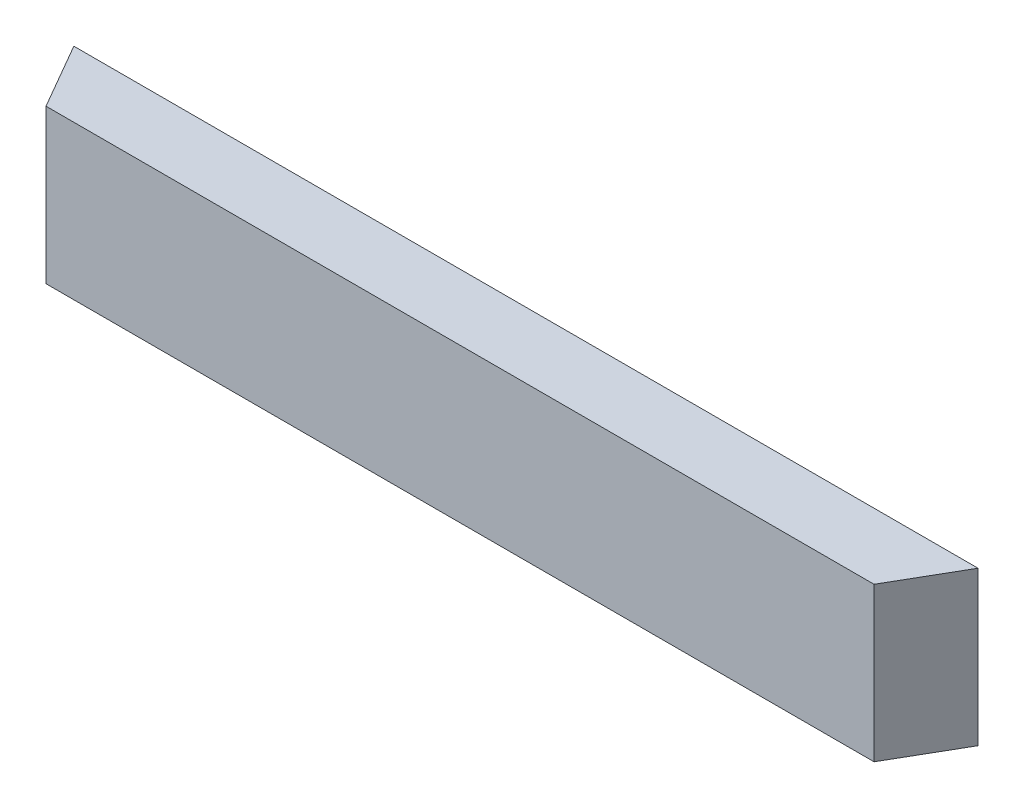
ISO-10303-21;
HEADER;
FILE_DESCRIPTION(('STEP AP214'),'2;1');
FILE_NAME('part.step','',(''),(''),'','','');
FILE_SCHEMA(('AUTOMOTIVE_DESIGN { 1 0 10303 214 1 1 1 1 }'));
ENDSEC;
DATA;
#1=APPLICATION_CONTEXT('core data for automotive mechanical design processes');
#2=APPLICATION_PROTOCOL_DEFINITION('international standard','automotive_design',2000,#1);
#3=PRODUCT_CONTEXT('',#1,'mechanical');
#4=PRODUCT('Part','Part','',(#3));
#5=PRODUCT_RELATED_PRODUCT_CATEGORY('part','',(#4));
#6=PRODUCT_DEFINITION_FORMATION('','',#4);
#7=PRODUCT_DEFINITION_CONTEXT('part definition',#1,'design');
#8=PRODUCT_DEFINITION('design','',#6,#7);
#9=PRODUCT_DEFINITION_SHAPE('','',#8);
#10=(LENGTH_UNIT() NAMED_UNIT(*) SI_UNIT(.MILLI.,.METRE.));
#11=(NAMED_UNIT(*) PLANE_ANGLE_UNIT() SI_UNIT($,.RADIAN.));
#12=(NAMED_UNIT(*) SI_UNIT($,.STERADIAN.) SOLID_ANGLE_UNIT());
#13=UNCERTAINTY_MEASURE_WITH_UNIT(LENGTH_MEASURE(1.E-05),#10,'distance_accuracy_value','');
#14=(GEOMETRIC_REPRESENTATION_CONTEXT(3) GLOBAL_UNCERTAINTY_ASSIGNED_CONTEXT((#13)) GLOBAL_UNIT_ASSIGNED_CONTEXT((#10,
#11,#12)) REPRESENTATION_CONTEXT('',''));
#15=CARTESIAN_POINT('',(0.,0.,0.));
#16=DIRECTION('',(0.,0.,1.));
#17=DIRECTION('',(1.,0.,0.));
#18=AXIS2_PLACEMENT_3D('',#15,#16,#17);
#19=CARTESIAN_POINT('',(478.79,88.9,0.));
#20=DIRECTION('',(-0.866025403784436,0.,-0.500000000000004));
#21=DIRECTION('',(-0.500000000000004,0.,0.866025403784436));
#22=AXIS2_PLACEMENT_3D('',#19,#20,#21);
#23=PLANE('',#22);
#24=DIRECTION('',(0.500000000000004,0.,-0.866025403784436));
#25=VECTOR('',#24,1.);
#26=CARTESIAN_POINT('',(478.79,0.,0.));
#27=LINE('',#26,#25);
#28=CARTESIAN_POINT('',(478.79,0.,0.));
#29=VERTEX_POINT('',#28);
#30=CARTESIAN_POINT('',(500.787045256125,0.,-38.1));
#31=VERTEX_POINT('',#30);
#32=EDGE_CURVE('E96',#29,#31,#27,.T.);
#33=ORIENTED_EDGE('',*,*,#32,.T.);
#34=DIRECTION('',(0.,-1.,0.));
#35=VECTOR('',#34,1.);
#36=CARTESIAN_POINT('',(500.787045256125,88.9,-38.1));
#37=LINE('',#36,#35);
#38=CARTESIAN_POINT('',(500.787045256125,88.9,-38.1));
#39=VERTEX_POINT('',#38);
#40=EDGE_CURVE('E11',#39,#31,#37,.T.);
#41=ORIENTED_EDGE('',*,*,#40,.F.);
#42=DIRECTION('',(0.500000000000004,0.,-0.866025403784436));
#43=VECTOR('',#42,1.);
#44=CARTESIAN_POINT('',(478.79,88.9,0.));
#45=LINE('',#44,#43);
#46=CARTESIAN_POINT('',(478.79,88.9,0.));
#47=VERTEX_POINT('',#46);
#48=EDGE_CURVE('E84',#47,#39,#45,.T.);
#49=ORIENTED_EDGE('',*,*,#48,.F.);
#50=DIRECTION('',(0.,-1.,0.));
#51=VECTOR('',#50,1.);
#52=CARTESIAN_POINT('',(478.79,88.9,0.));
#53=LINE('',#52,#51);
#54=EDGE_CURVE('E92',#47,#29,#53,.T.);
#55=ORIENTED_EDGE('',*,*,#54,.T.);
#56=EDGE_LOOP('',(#33,#41,#49,#55));
#57=FACE_BOUND('',#56,.T.);
#58=ADVANCED_FACE('F33',(#57),#23,.F.);
#59=CARTESIAN_POINT('',(500.787045256125,88.9,-38.1));
#60=DIRECTION('',(0.,0.,1.));
#61=DIRECTION('',(1.,0.,0.));
#62=AXIS2_PLACEMENT_3D('',#59,#60,#61);
#63=PLANE('',#62);
#64=DIRECTION('',(-1.,0.,0.));
#65=VECTOR('',#64,1.);
#66=CARTESIAN_POINT('',(500.787045256125,0.,-38.1));
#67=LINE('',#66,#65);
#68=CARTESIAN_POINT('',(-21.997045256125,0.,-38.0999999999999));
#69=VERTEX_POINT('',#68);
#70=EDGE_CURVE('E88',#31,#69,#67,.T.);
#71=ORIENTED_EDGE('',*,*,#70,.T.);
#72=DIRECTION('',(0.,-1.,0.));
#73=VECTOR('',#72,1.);
#74=CARTESIAN_POINT('',(-21.997045256125,88.9,-38.0999999999999));
#75=LINE('',#74,#73);
#76=CARTESIAN_POINT('',(-21.997045256125,88.9,-38.0999999999999));
#77=VERTEX_POINT('',#76);
#78=EDGE_CURVE('E41',#77,#69,#75,.T.);
#79=ORIENTED_EDGE('',*,*,#78,.F.);
#80=DIRECTION('',(-1.,0.,0.));
#81=VECTOR('',#80,1.);
#82=CARTESIAN_POINT('',(500.787045256125,88.9,-38.1));
#83=LINE('',#82,#81);
#84=EDGE_CURVE('E79',#39,#77,#83,.T.);
#85=ORIENTED_EDGE('',*,*,#84,.F.);
#86=ORIENTED_EDGE('',*,*,#40,.T.);
#87=EDGE_LOOP('',(#71,#79,#85,#86));
#88=FACE_BOUND('',#87,.T.);
#89=ADVANCED_FACE('F87',(#88),#63,.F.);
#90=CARTESIAN_POINT('',(-21.997045256125,88.9,-38.0999999999999));
#91=DIRECTION('',(0.866025403784436,0.,-0.500000000000004));
#92=DIRECTION('',(-0.500000000000004,0.,-0.866025403784436));
#93=AXIS2_PLACEMENT_3D('',#90,#91,#92);
#94=PLANE('',#93);
#95=DIRECTION('',(0.500000000000004,0.,0.866025403784436));
#96=VECTOR('',#95,1.);
#97=CARTESIAN_POINT('',(-21.997045256125,0.,-38.0999999999999));
#98=LINE('',#97,#96);
#99=CARTESIAN_POINT('',(0.,0.,0.));
#100=VERTEX_POINT('',#99);
#101=EDGE_CURVE('E66',#69,#100,#98,.T.);
#102=ORIENTED_EDGE('',*,*,#101,.T.);
#103=DIRECTION('',(0.,-1.,0.));
#104=VECTOR('',#103,1.);
#105=CARTESIAN_POINT('',(0.,88.9,0.));
#106=LINE('',#105,#104);
#107=CARTESIAN_POINT('',(0.,88.9,0.));
#108=VERTEX_POINT('',#107);
#109=EDGE_CURVE('E89',#108,#100,#106,.T.);
#110=ORIENTED_EDGE('',*,*,#109,.F.);
#111=DIRECTION('',(0.500000000000004,0.,0.866025403784436));
#112=VECTOR('',#111,1.);
#113=CARTESIAN_POINT('',(-21.997045256125,88.9,-38.0999999999999));
#114=LINE('',#113,#112);
#115=EDGE_CURVE('E82',#77,#108,#114,.T.);
#116=ORIENTED_EDGE('',*,*,#115,.F.);
#117=ORIENTED_EDGE('',*,*,#78,.T.);
#118=EDGE_LOOP('',(#102,#110,#116,#117));
#119=FACE_BOUND('',#118,.T.);
#120=ADVANCED_FACE('F90',(#119),#94,.F.);
#121=CARTESIAN_POINT('',(0.,88.9,0.));
#122=DIRECTION('',(0.,0.,-1.));
#123=DIRECTION('',(-1.,0.,0.));
#124=AXIS2_PLACEMENT_3D('',#121,#122,#123);
#125=PLANE('',#124);
#126=DIRECTION('',(1.,0.,0.));
#127=VECTOR('',#126,1.);
#128=CARTESIAN_POINT('',(0.,0.,0.));
#129=LINE('',#128,#127);
#130=EDGE_CURVE('E72',#100,#29,#129,.T.);
#131=ORIENTED_EDGE('',*,*,#130,.T.);
#132=ORIENTED_EDGE('',*,*,#54,.F.);
#133=DIRECTION('',(1.,0.,0.));
#134=VECTOR('',#133,1.);
#135=CARTESIAN_POINT('',(0.,88.9,0.));
#136=LINE('',#135,#134);
#137=EDGE_CURVE('E49',#108,#47,#136,.T.);
#138=ORIENTED_EDGE('',*,*,#137,.F.);
#139=ORIENTED_EDGE('',*,*,#109,.T.);
#140=EDGE_LOOP('',(#131,#132,#138,#139));
#141=FACE_BOUND('',#140,.T.);
#142=ADVANCED_FACE('F103',(#141),#125,.F.);
#143=CARTESIAN_POINT('',(0.,88.9,0.));
#144=DIRECTION('',(0.,1.,0.));
#145=DIRECTION('',(0.,0.,1.));
#146=AXIS2_PLACEMENT_3D('',#143,#144,#145);
#147=PLANE('',#146);
#148=ORIENTED_EDGE('',*,*,#48,.T.);
#149=ORIENTED_EDGE('',*,*,#84,.T.);
#150=ORIENTED_EDGE('',*,*,#115,.T.);
#151=ORIENTED_EDGE('',*,*,#137,.T.);
#152=EDGE_LOOP('',(#148,#149,#150,#151));
#153=FACE_BOUND('',#152,.T.);
#154=ADVANCED_FACE('F80',(#153),#147,.T.);
#155=CARTESIAN_POINT('',(0.,0.,0.));
#156=DIRECTION('',(0.,1.,0.));
#157=DIRECTION('',(0.,0.,1.));
#158=AXIS2_PLACEMENT_3D('',#155,#156,#157);
#159=PLANE('',#158);
#160=ORIENTED_EDGE('',*,*,#32,.F.);
#161=ORIENTED_EDGE('',*,*,#130,.F.);
#162=ORIENTED_EDGE('',*,*,#101,.F.);
#163=ORIENTED_EDGE('',*,*,#70,.F.);
#164=EDGE_LOOP('',(#160,#161,#162,#163));
#165=FACE_BOUND('',#164,.T.);
#166=ADVANCED_FACE('F106',(#165),#159,.F.);
#167=CLOSED_SHELL('',(#58,#89,#120,#142,#154,#166));
#168=MANIFOLD_SOLID_BREP('B2',#167);
#169=ADVANCED_BREP_SHAPE_REPRESENTATION('',(#18,#168),#14);
#170=SHAPE_DEFINITION_REPRESENTATION(#9,#169);
ENDSEC;
END-ISO-10303-21;
